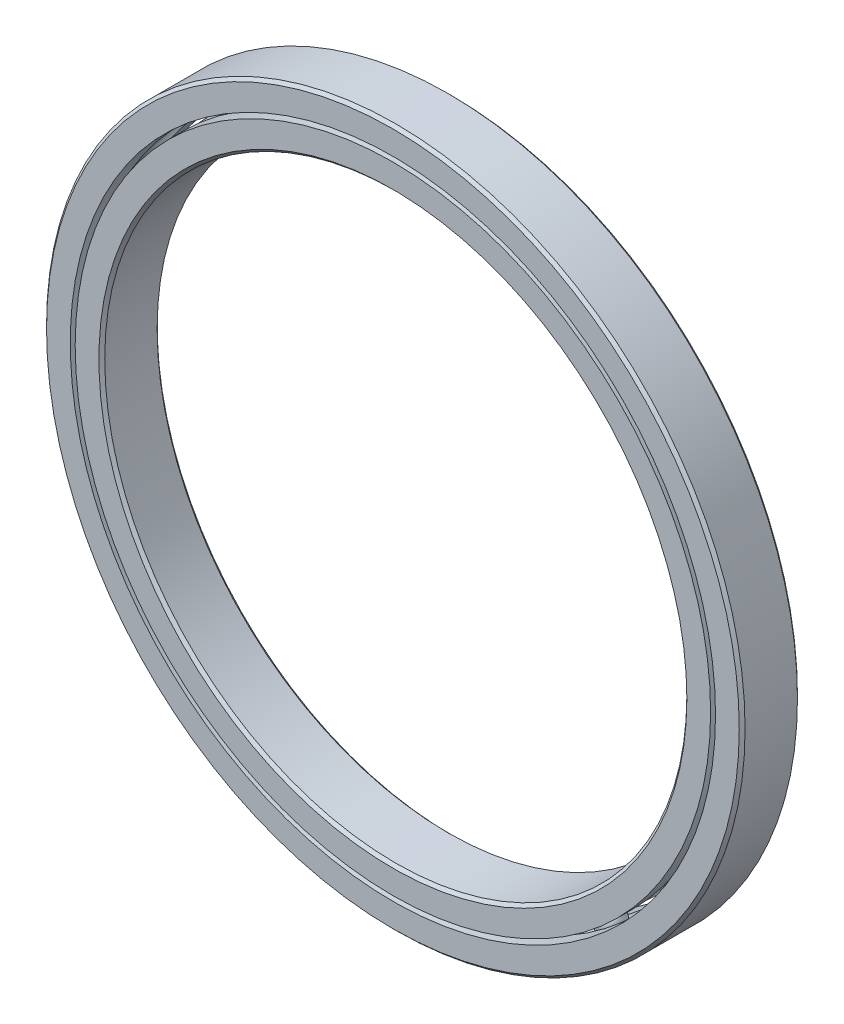
ISO-10303-21;
HEADER;
FILE_DESCRIPTION(('STEP AP214'),'2;1');
FILE_NAME('part.step','',(''),(''),'','','');
FILE_SCHEMA(('AUTOMOTIVE_DESIGN { 1 0 10303 214 1 1 1 1 }'));
ENDSEC;
DATA;
#1=APPLICATION_CONTEXT('core data for automotive mechanical design processes');
#2=APPLICATION_PROTOCOL_DEFINITION('international standard','automotive_design',2000,#1);
#3=PRODUCT_CONTEXT('',#1,'mechanical');
#4=PRODUCT('Part','Part','',(#3));
#5=PRODUCT_RELATED_PRODUCT_CATEGORY('part','',(#4));
#6=PRODUCT_DEFINITION_FORMATION('','',#4);
#7=PRODUCT_DEFINITION_CONTEXT('part definition',#1,'design');
#8=PRODUCT_DEFINITION('design','',#6,#7);
#9=PRODUCT_DEFINITION_SHAPE('','',#8);
#10=(LENGTH_UNIT() NAMED_UNIT(*) SI_UNIT(.MILLI.,.METRE.));
#11=(NAMED_UNIT(*) PLANE_ANGLE_UNIT() SI_UNIT($,.RADIAN.));
#12=(NAMED_UNIT(*) SI_UNIT($,.STERADIAN.) SOLID_ANGLE_UNIT());
#13=UNCERTAINTY_MEASURE_WITH_UNIT(LENGTH_MEASURE(1.E-05),#10,'distance_accuracy_value','');
#14=(GEOMETRIC_REPRESENTATION_CONTEXT(3) GLOBAL_UNCERTAINTY_ASSIGNED_CONTEXT((#13)) GLOBAL_UNIT_ASSIGNED_CONTEXT((#10,
#11,#12)) REPRESENTATION_CONTEXT('',''));
#15=CARTESIAN_POINT('',(0.,0.,0.));
#16=DIRECTION('',(0.,0.,1.));
#17=DIRECTION('',(1.,0.,0.));
#18=AXIS2_PLACEMENT_3D('',#15,#16,#17);
#19=CARTESIAN_POINT('',(-20.5283999363143,28.2549185285453,0.));
#20=DIRECTION('',(0.,0.,1.));
#21=DIRECTION('',(-0.587785252292462,0.809016994374955,0.));
#22=AXIS2_PLACEMENT_3D('',#19,#20,#21);
#23=SPHERICAL_SURFACE('',#22,1.4364572590072);
#24=CARTESIAN_POINT('',(-20.5283999363143,28.2549185285453,1.4364572590072));
#25=VERTEX_POINT('',#24);
#26=VERTEX_LOOP('',#25);
#27=FACE_BOUND('',#26,.T.);
#28=ADVANCED_FACE('F37',(#27),#23,.T.);
#29=CLOSED_SHELL('',(#28));
#30=MANIFOLD_SOLID_BREP('B2',#29);
#31=CARTESIAN_POINT('',(-33.2156488316081,10.7924185285454,0.));
#32=DIRECTION('',(0.,0.,1.));
#33=DIRECTION('',(-0.95105651629515,0.309016994374958,0.));
#34=AXIS2_PLACEMENT_3D('',#31,#32,#33);
#35=SPHERICAL_SURFACE('',#34,1.4364572590072);
#36=CARTESIAN_POINT('',(-33.2156488316081,10.7924185285454,1.4364572590072));
#37=VERTEX_POINT('',#36);
#38=VERTEX_LOOP('',#37);
#39=FACE_BOUND('',#38,.T.);
#40=ADVANCED_FACE('F57',(#39),#35,.T.);
#41=CLOSED_SHELL('',(#40));
#42=MANIFOLD_SOLID_BREP('B6',#41);
#43=CARTESIAN_POINT('',(-33.2156488316083,-10.7924185285447,0.));
#44=DIRECTION('',(0.,0.,1.));
#45=DIRECTION('',(-0.951056516295157,-0.309016994374938,0.));
#46=AXIS2_PLACEMENT_3D('',#43,#44,#45);
#47=SPHERICAL_SURFACE('',#46,1.4364572590072);
#48=CARTESIAN_POINT('',(-33.2156488316083,-10.7924185285447,1.4364572590072));
#49=VERTEX_POINT('',#48);
#50=VERTEX_LOOP('',#49);
#51=FACE_BOUND('',#50,.T.);
#52=ADVANCED_FACE('F77',(#51),#47,.T.);
#53=CLOSED_SHELL('',(#52));
#54=MANIFOLD_SOLID_BREP('B33',#53);
#55=CARTESIAN_POINT('',(-20.5283999363149,-28.2549185285449,0.));
#56=DIRECTION('',(0.,0.,1.));
#57=DIRECTION('',(-0.58778525229248,-0.809016994374942,0.));
#58=AXIS2_PLACEMENT_3D('',#55,#56,#57);
#59=SPHERICAL_SURFACE('',#58,1.4364572590072);
#60=CARTESIAN_POINT('',(-20.5283999363149,-28.2549185285449,1.4364572590072));
#61=VERTEX_POINT('',#60);
#62=VERTEX_LOOP('',#61);
#63=FACE_BOUND('',#62,.T.);
#64=ADVANCED_FACE('F97',(#63),#59,.T.);
#65=CLOSED_SHELL('',(#64));
#66=MANIFOLD_SOLID_BREP('B53',#65);
#67=CARTESIAN_POINT('',(-2.43879971518193E-13,-34.925,0.));
#68=DIRECTION('',(0.,0.,1.));
#69=DIRECTION('',(0.,-1.,0.));
#70=AXIS2_PLACEMENT_3D('',#67,#68,#69);
#71=SPHERICAL_SURFACE('',#70,1.4364572590072);
#72=CARTESIAN_POINT('',(-2.43879971518193E-13,-34.925,1.4364572590072));
#73=VERTEX_POINT('',#72);
#74=VERTEX_LOOP('',#73);
#75=FACE_BOUND('',#74,.T.);
#76=ADVANCED_FACE('F117',(#75),#71,.T.);
#77=CLOSED_SHELL('',(#76));
#78=MANIFOLD_SOLID_BREP('B73',#77);
#79=CARTESIAN_POINT('',(20.5283999363145,-28.2549185285452,0.));
#80=DIRECTION('',(0.,0.,1.));
#81=DIRECTION('',(0.587785252292469,-0.809016994374951,0.));
#82=AXIS2_PLACEMENT_3D('',#79,#80,#81);
#83=SPHERICAL_SURFACE('',#82,1.4364572590072);
#84=CARTESIAN_POINT('',(20.5283999363145,-28.2549185285452,1.4364572590072));
#85=VERTEX_POINT('',#84);
#86=VERTEX_LOOP('',#85);
#87=FACE_BOUND('',#86,.T.);
#88=ADVANCED_FACE('F137',(#87),#83,.T.);
#89=CLOSED_SHELL('',(#88));
#90=MANIFOLD_SOLID_BREP('B93',#89);
#91=CARTESIAN_POINT('',(33.2156488316082,-10.7924185285452,0.));
#92=DIRECTION('',(0.,0.,1.));
#93=DIRECTION('',(0.951056516295152,-0.309016994374952,0.));
#94=AXIS2_PLACEMENT_3D('',#91,#92,#93);
#95=SPHERICAL_SURFACE('',#94,1.4364572590072);
#96=CARTESIAN_POINT('',(33.2156488316082,-10.7924185285452,1.4364572590072));
#97=VERTEX_POINT('',#96);
#98=VERTEX_LOOP('',#97);
#99=FACE_BOUND('',#98,.T.);
#100=ADVANCED_FACE('F157',(#99),#95,.T.);
#101=CLOSED_SHELL('',(#100));
#102=MANIFOLD_SOLID_BREP('B113',#101);
#103=CARTESIAN_POINT('',(33.2156488316083,10.7924185285449,0.));
#104=DIRECTION('',(0.,0.,1.));
#105=DIRECTION('',(0.951056516295155,0.309016994374945,0.));
#106=AXIS2_PLACEMENT_3D('',#103,#104,#105);
#107=SPHERICAL_SURFACE('',#106,1.4364572590072);
#108=CARTESIAN_POINT('',(33.2156488316083,10.7924185285449,1.4364572590072));
#109=VERTEX_POINT('',#108);
#110=VERTEX_LOOP('',#109);
#111=FACE_BOUND('',#110,.T.);
#112=ADVANCED_FACE('F177',(#111),#107,.T.);
#113=CLOSED_SHELL('',(#112));
#114=MANIFOLD_SOLID_BREP('B133',#113);
#115=CARTESIAN_POINT('',(20.5283999363147,28.254918528545,0.));
#116=DIRECTION('',(0.,0.,1.));
#117=DIRECTION('',(0.587785252292474,0.809016994374947,0.));
#118=AXIS2_PLACEMENT_3D('',#115,#116,#117);
#119=SPHERICAL_SURFACE('',#118,1.4364572590072);
#120=CARTESIAN_POINT('',(20.5283999363147,28.254918528545,1.4364572590072));
#121=VERTEX_POINT('',#120);
#122=VERTEX_LOOP('',#121);
#123=FACE_BOUND('',#122,.T.);
#124=ADVANCED_FACE('F197',(#123),#119,.T.);
#125=CLOSED_SHELL('',(#124));
#126=MANIFOLD_SOLID_BREP('B153',#125);
#127=CARTESIAN_POINT('',(0.,34.925,0.));
#128=DIRECTION('',(0.,0.,1.));
#129=DIRECTION('',(0.,1.,0.));
#130=AXIS2_PLACEMENT_3D('',#127,#128,#129);
#131=SPHERICAL_SURFACE('',#130,1.4364572590072);
#132=CARTESIAN_POINT('',(0.,34.925,1.4364572590072));
#133=VERTEX_POINT('',#132);
#134=VERTEX_LOOP('',#133);
#135=FACE_BOUND('',#134,.T.);
#136=ADVANCED_FACE('F219',(#135),#131,.T.);
#137=CLOSED_SHELL('',(#136));
#138=MANIFOLD_SOLID_BREP('B173',#137);
#139=CARTESIAN_POINT('',(0.,34.6563461538462,3.17500000000001));
#140=DIRECTION('',(0.,0.,-1.));
#141=DIRECTION('',(-1.,0.,0.));
#142=AXIS2_PLACEMENT_3D('',#139,#140,#141);
#143=PLANE('',#142);
#144=CARTESIAN_POINT('',(0.,0.,3.17500000000001));
#145=DIRECTION('',(0.,0.,1.));
#146=DIRECTION('',(1.,0.,0.));
#147=AXIS2_PLACEMENT_3D('',#144,#145,#146);
#148=CIRCLE('',#147,32.0675);
#149=CARTESIAN_POINT('',(32.0675,0.,3.17500000000001));
#150=VERTEX_POINT('',#149);
#151=EDGE_CURVE('E266',#150,#150,#148,.T.);
#152=ORIENTED_EDGE('',*,*,#151,.F.);
#153=EDGE_LOOP('',(#152));
#154=FACE_BOUND('',#153,.T.);
#155=CARTESIAN_POINT('',(0.,0.,3.17500000000001));
#156=DIRECTION('',(0.,0.,1.));
#157=DIRECTION('',(1.,0.,0.));
#158=AXIS2_PLACEMENT_3D('',#155,#156,#157);
#159=CIRCLE('',#158,34.6563461538462);
#160=CARTESIAN_POINT('',(34.6563461538462,0.,3.17500000000001));
#161=VERTEX_POINT('',#160);
#162=EDGE_CURVE('E218',#161,#161,#159,.T.);
#163=ORIENTED_EDGE('',*,*,#162,.T.);
#164=EDGE_LOOP('',(#163));
#165=FACE_BOUND('',#164,.T.);
#166=ADVANCED_FACE('F238',(#154,#165),#143,.F.);
#167=CARTESIAN_POINT('',(0.,0.,3.175));
#168=DIRECTION('',(0.,0.,1.));
#169=DIRECTION('',(1.,0.,0.));
#170=AXIS2_PLACEMENT_3D('',#167,#168,#169);
#171=CYLINDRICAL_SURFACE('',#170,34.6563461538462);
#172=ORIENTED_EDGE('',*,*,#162,.F.);
#173=EDGE_LOOP('',(#172));
#174=FACE_BOUND('',#173,.T.);
#175=CARTESIAN_POINT('',(0.,0.,1.41111111111111));
#176=DIRECTION('',(0.,0.,1.));
#177=DIRECTION('',(1.,0.,0.));
#178=AXIS2_PLACEMENT_3D('',#175,#176,#177);
#179=CIRCLE('',#178,34.6563461538462);
#180=CARTESIAN_POINT('',(34.6563461538462,0.,1.41111111111111));
#181=VERTEX_POINT('',#180);
#182=EDGE_CURVE('E244',#181,#181,#179,.T.);
#183=ORIENTED_EDGE('',*,*,#182,.T.);
#184=EDGE_LOOP('',(#183));
#185=FACE_BOUND('',#184,.T.);
#186=ADVANCED_FACE('F273',(#174,#185),#171,.T.);
#187=CARTESIAN_POINT('',(0.,0.,0.));
#188=DIRECTION('',(0.,0.,1.));
#189=DIRECTION('',(1.,0.,0.));
#190=AXIS2_PLACEMENT_3D('',#187,#188,#189);
#191=TOROIDAL_SURFACE('',#190,34.925,1.43645725900719);
#192=ORIENTED_EDGE('',*,*,#182,.F.);
#193=EDGE_LOOP('',(#192));
#194=FACE_BOUND('',#193,.T.);
#195=CARTESIAN_POINT('',(0.,0.,-1.41111111111112));
#196=DIRECTION('',(0.,0.,1.));
#197=DIRECTION('',(1.,0.,0.));
#198=AXIS2_PLACEMENT_3D('',#195,#196,#197);
#199=CIRCLE('',#198,34.6563461538462);
#200=CARTESIAN_POINT('',(34.6563461538462,0.,-1.41111111111112));
#201=VERTEX_POINT('',#200);
#202=EDGE_CURVE('E248',#201,#201,#199,.T.);
#203=ORIENTED_EDGE('',*,*,#202,.T.);
#204=EDGE_LOOP('',(#203));
#205=FACE_BOUND('',#204,.T.);
#206=ADVANCED_FACE('F277',(#194,#205),#191,.F.);
#207=CARTESIAN_POINT('',(0.,0.,3.175));
#208=DIRECTION('',(0.,0.,1.));
#209=DIRECTION('',(1.,0.,0.));
#210=AXIS2_PLACEMENT_3D('',#207,#208,#209);
#211=CYLINDRICAL_SURFACE('',#210,34.6563461538462);
#212=ORIENTED_EDGE('',*,*,#202,.F.);
#213=EDGE_LOOP('',(#212));
#214=FACE_BOUND('',#213,.T.);
#215=CARTESIAN_POINT('',(0.,0.,-3.17500000000001));
#216=DIRECTION('',(0.,0.,1.));
#217=DIRECTION('',(1.,0.,0.));
#218=AXIS2_PLACEMENT_3D('',#215,#216,#217);
#219=CIRCLE('',#218,34.6563461538462);
#220=CARTESIAN_POINT('',(34.6563461538462,0.,-3.17500000000001));
#221=VERTEX_POINT('',#220);
#222=EDGE_CURVE('E252',#221,#221,#219,.T.);
#223=ORIENTED_EDGE('',*,*,#222,.T.);
#224=EDGE_LOOP('',(#223));
#225=FACE_BOUND('',#224,.T.);
#226=ADVANCED_FACE('F282',(#214,#225),#211,.T.);
#227=CARTESIAN_POINT('',(0.,32.0675,-3.17500000000001));
#228=DIRECTION('',(0.,0.,1.));
#229=DIRECTION('',(1.,0.,0.));
#230=AXIS2_PLACEMENT_3D('',#227,#228,#229);
#231=PLANE('',#230);
#232=ORIENTED_EDGE('',*,*,#222,.F.);
#233=EDGE_LOOP('',(#232));
#234=FACE_BOUND('',#233,.T.);
#235=CARTESIAN_POINT('',(0.,0.,-3.17500000000001));
#236=DIRECTION('',(0.,0.,1.));
#237=DIRECTION('',(1.,0.,0.));
#238=AXIS2_PLACEMENT_3D('',#235,#236,#237);
#239=CIRCLE('',#238,32.0675);
#240=CARTESIAN_POINT('',(32.0675,0.,-3.17500000000001));
#241=VERTEX_POINT('',#240);
#242=EDGE_CURVE('E257',#241,#241,#239,.T.);
#243=ORIENTED_EDGE('',*,*,#242,.T.);
#244=EDGE_LOOP('',(#243));
#245=FACE_BOUND('',#244,.T.);
#246=ADVANCED_FACE('F288',(#234,#245),#231,.F.);
#247=CARTESIAN_POINT('',(0.,0.,-2.8575));
#248=DIRECTION('',(0.,0.,-1.));
#249=DIRECTION('',(-1.,0.,0.));
#250=AXIS2_PLACEMENT_3D('',#247,#248,#249);
#251=CONICAL_SURFACE('',#250,31.75,0.785398163397444);
#252=ORIENTED_EDGE('',*,*,#242,.F.);
#253=EDGE_LOOP('',(#252));
#254=FACE_BOUND('',#253,.T.);
#255=CARTESIAN_POINT('',(0.,0.,-2.8575));
#256=DIRECTION('',(0.,0.,1.));
#257=DIRECTION('',(1.,0.,0.));
#258=AXIS2_PLACEMENT_3D('',#255,#256,#257);
#259=CIRCLE('',#258,31.75);
#260=CARTESIAN_POINT('',(31.75,0.,-2.8575));
#261=VERTEX_POINT('',#260);
#262=EDGE_CURVE('E260',#261,#261,#259,.T.);
#263=ORIENTED_EDGE('',*,*,#262,.T.);
#264=EDGE_LOOP('',(#263));
#265=FACE_BOUND('',#264,.T.);
#266=ADVANCED_FACE('F292',(#254,#265),#251,.F.);
#267=CARTESIAN_POINT('',(0.,0.,3.175));
#268=DIRECTION('',(0.,0.,1.));
#269=DIRECTION('',(1.,0.,0.));
#270=AXIS2_PLACEMENT_3D('',#267,#268,#269);
#271=CYLINDRICAL_SURFACE('',#270,31.75);
#272=ORIENTED_EDGE('',*,*,#262,.F.);
#273=EDGE_LOOP('',(#272));
#274=FACE_BOUND('',#273,.T.);
#275=CARTESIAN_POINT('',(0.,0.,2.85750000000001));
#276=DIRECTION('',(0.,0.,1.));
#277=DIRECTION('',(1.,0.,0.));
#278=AXIS2_PLACEMENT_3D('',#275,#276,#277);
#279=CIRCLE('',#278,31.75);
#280=CARTESIAN_POINT('',(31.75,0.,2.85750000000001));
#281=VERTEX_POINT('',#280);
#282=EDGE_CURVE('E263',#281,#281,#279,.T.);
#283=ORIENTED_EDGE('',*,*,#282,.T.);
#284=EDGE_LOOP('',(#283));
#285=FACE_BOUND('',#284,.T.);
#286=ADVANCED_FACE('F296',(#274,#285),#271,.F.);
#287=CARTESIAN_POINT('',(0.,0.,3.17500000000001));
#288=DIRECTION('',(0.,0.,1.));
#289=DIRECTION('',(1.,0.,0.));
#290=AXIS2_PLACEMENT_3D('',#287,#288,#289);
#291=CONICAL_SURFACE('',#290,32.0675,0.785398163397446);
#292=ORIENTED_EDGE('',*,*,#282,.F.);
#293=EDGE_LOOP('',(#292));
#294=FACE_BOUND('',#293,.T.);
#295=ORIENTED_EDGE('',*,*,#151,.T.);
#296=EDGE_LOOP('',(#295));
#297=FACE_BOUND('',#296,.T.);
#298=ADVANCED_FACE('F270',(#294,#297),#291,.F.);
#299=CLOSED_SHELL('',(#166,#186,#206,#226,#246,#266,#286,#298));
#300=MANIFOLD_SOLID_BREP('B193',#299);
#301=CARTESIAN_POINT('',(0.,0.,2.8575));
#302=DIRECTION('',(0.,0.,-1.));
#303=DIRECTION('',(-1.,0.,0.));
#304=AXIS2_PLACEMENT_3D('',#301,#302,#303);
#305=CONICAL_SURFACE('',#304,38.1,0.785398163397446);
#306=CARTESIAN_POINT('',(0.,0.,3.17500000000001));
#307=DIRECTION('',(0.,0.,1.));
#308=DIRECTION('',(1.,0.,0.));
#309=AXIS2_PLACEMENT_3D('',#306,#307,#308);
#310=CIRCLE('',#309,37.7825);
#311=CARTESIAN_POINT('',(37.7825,0.,3.17500000000001));
#312=VERTEX_POINT('',#311);
#313=EDGE_CURVE('E387',#312,#312,#310,.T.);
#314=ORIENTED_EDGE('',*,*,#313,.F.);
#315=EDGE_LOOP('',(#314));
#316=FACE_BOUND('',#315,.T.);
#317=CARTESIAN_POINT('',(0.,0.,2.8575));
#318=DIRECTION('',(0.,0.,1.));
#319=DIRECTION('',(1.,0.,0.));
#320=AXIS2_PLACEMENT_3D('',#317,#318,#319);
#321=CIRCLE('',#320,38.1);
#322=CARTESIAN_POINT('',(38.1,0.,2.8575));
#323=VERTEX_POINT('',#322);
#324=EDGE_CURVE('E237',#323,#323,#321,.T.);
#325=ORIENTED_EDGE('',*,*,#324,.T.);
#326=EDGE_LOOP('',(#325));
#327=FACE_BOUND('',#326,.T.);
#328=ADVANCED_FACE('F359',(#316,#327),#305,.T.);
#329=CARTESIAN_POINT('',(0.,0.,3.175));
#330=DIRECTION('',(0.,0.,1.));
#331=DIRECTION('',(1.,0.,0.));
#332=AXIS2_PLACEMENT_3D('',#329,#330,#331);
#333=CYLINDRICAL_SURFACE('',#332,38.1);
#334=ORIENTED_EDGE('',*,*,#324,.F.);
#335=EDGE_LOOP('',(#334));
#336=FACE_BOUND('',#335,.T.);
#337=CARTESIAN_POINT('',(0.,0.,-2.8575));
#338=DIRECTION('',(0.,0.,1.));
#339=DIRECTION('',(1.,0.,0.));
#340=AXIS2_PLACEMENT_3D('',#337,#338,#339);
#341=CIRCLE('',#340,38.1);
#342=CARTESIAN_POINT('',(38.1,0.,-2.8575));
#343=VERTEX_POINT('',#342);
#344=EDGE_CURVE('E365',#343,#343,#341,.T.);
#345=ORIENTED_EDGE('',*,*,#344,.T.);
#346=EDGE_LOOP('',(#345));
#347=FACE_BOUND('',#346,.T.);
#348=ADVANCED_FACE('F394',(#336,#347),#333,.T.);
#349=CARTESIAN_POINT('',(0.,0.,-3.17500000000001));
#350=DIRECTION('',(0.,0.,1.));
#351=DIRECTION('',(1.,0.,0.));
#352=AXIS2_PLACEMENT_3D('',#349,#350,#351);
#353=CONICAL_SURFACE('',#352,37.7825,0.785398163397444);
#354=ORIENTED_EDGE('',*,*,#344,.F.);
#355=EDGE_LOOP('',(#354));
#356=FACE_BOUND('',#355,.T.);
#357=CARTESIAN_POINT('',(0.,0.,-3.17500000000001));
#358=DIRECTION('',(0.,0.,1.));
#359=DIRECTION('',(1.,0.,0.));
#360=AXIS2_PLACEMENT_3D('',#357,#358,#359);
#361=CIRCLE('',#360,37.7825);
#362=CARTESIAN_POINT('',(37.7825,0.,-3.17500000000001));
#363=VERTEX_POINT('',#362);
#364=EDGE_CURVE('E369',#363,#363,#361,.T.);
#365=ORIENTED_EDGE('',*,*,#364,.T.);
#366=EDGE_LOOP('',(#365));
#367=FACE_BOUND('',#366,.T.);
#368=ADVANCED_FACE('F398',(#356,#367),#353,.T.);
#369=CARTESIAN_POINT('',(0.,37.7825,-3.17500000000001));
#370=DIRECTION('',(0.,0.,1.));
#371=DIRECTION('',(1.,0.,0.));
#372=AXIS2_PLACEMENT_3D('',#369,#370,#371);
#373=PLANE('',#372);
#374=ORIENTED_EDGE('',*,*,#364,.F.);
#375=EDGE_LOOP('',(#374));
#376=FACE_BOUND('',#375,.T.);
#377=CARTESIAN_POINT('',(0.,0.,-3.17500000000001));
#378=DIRECTION('',(0.,0.,1.));
#379=DIRECTION('',(1.,0.,0.));
#380=AXIS2_PLACEMENT_3D('',#377,#378,#379);
#381=CIRCLE('',#380,35.1936538461538);
#382=CARTESIAN_POINT('',(35.1936538461538,0.,-3.17500000000001));
#383=VERTEX_POINT('',#382);
#384=EDGE_CURVE('E373',#383,#383,#381,.T.);
#385=ORIENTED_EDGE('',*,*,#384,.T.);
#386=EDGE_LOOP('',(#385));
#387=FACE_BOUND('',#386,.T.);
#388=ADVANCED_FACE('F403',(#376,#387),#373,.F.);
#389=CARTESIAN_POINT('',(0.,0.,3.175));
#390=DIRECTION('',(0.,0.,1.));
#391=DIRECTION('',(1.,0.,0.));
#392=AXIS2_PLACEMENT_3D('',#389,#390,#391);
#393=CYLINDRICAL_SURFACE('',#392,35.1936538461538);
#394=ORIENTED_EDGE('',*,*,#384,.F.);
#395=EDGE_LOOP('',(#394));
#396=FACE_BOUND('',#395,.T.);
#397=CARTESIAN_POINT('',(0.,0.,-1.41111111111111));
#398=DIRECTION('',(0.,0.,1.));
#399=DIRECTION('',(1.,0.,0.));
#400=AXIS2_PLACEMENT_3D('',#397,#398,#399);
#401=CIRCLE('',#400,35.1936538461538);
#402=CARTESIAN_POINT('',(35.1936538461538,0.,-1.41111111111111));
#403=VERTEX_POINT('',#402);
#404=EDGE_CURVE('E378',#403,#403,#401,.T.);
#405=ORIENTED_EDGE('',*,*,#404,.T.);
#406=EDGE_LOOP('',(#405));
#407=FACE_BOUND('',#406,.T.);
#408=ADVANCED_FACE('F409',(#396,#407),#393,.F.);
#409=CARTESIAN_POINT('',(0.,0.,0.));
#410=DIRECTION('',(0.,0.,1.));
#411=DIRECTION('',(1.,0.,0.));
#412=AXIS2_PLACEMENT_3D('',#409,#410,#411);
#413=TOROIDAL_SURFACE('',#412,34.925,1.4364572590072);
#414=ORIENTED_EDGE('',*,*,#404,.F.);
#415=EDGE_LOOP('',(#414));
#416=FACE_BOUND('',#415,.T.);
#417=CARTESIAN_POINT('',(0.,0.,1.41111111111111));
#418=DIRECTION('',(0.,0.,1.));
#419=DIRECTION('',(1.,0.,0.));
#420=AXIS2_PLACEMENT_3D('',#417,#418,#419);
#421=CIRCLE('',#420,35.1936538461538);
#422=CARTESIAN_POINT('',(35.1936538461538,0.,1.41111111111111));
#423=VERTEX_POINT('',#422);
#424=EDGE_CURVE('E381',#423,#423,#421,.T.);
#425=ORIENTED_EDGE('',*,*,#424,.T.);
#426=EDGE_LOOP('',(#425));
#427=FACE_BOUND('',#426,.T.);
#428=ADVANCED_FACE('F413',(#416,#427),#413,.F.);
#429=CARTESIAN_POINT('',(0.,0.,3.175));
#430=DIRECTION('',(0.,0.,1.));
#431=DIRECTION('',(1.,0.,0.));
#432=AXIS2_PLACEMENT_3D('',#429,#430,#431);
#433=CYLINDRICAL_SURFACE('',#432,35.1936538461538);
#434=ORIENTED_EDGE('',*,*,#424,.F.);
#435=EDGE_LOOP('',(#434));
#436=FACE_BOUND('',#435,.T.);
#437=CARTESIAN_POINT('',(0.,0.,3.175));
#438=DIRECTION('',(0.,0.,1.));
#439=DIRECTION('',(1.,0.,0.));
#440=AXIS2_PLACEMENT_3D('',#437,#438,#439);
#441=CIRCLE('',#440,35.1936538461538);
#442=CARTESIAN_POINT('',(35.1936538461538,0.,3.175));
#443=VERTEX_POINT('',#442);
#444=EDGE_CURVE('E384',#443,#443,#441,.T.);
#445=ORIENTED_EDGE('',*,*,#444,.T.);
#446=EDGE_LOOP('',(#445));
#447=FACE_BOUND('',#446,.T.);
#448=ADVANCED_FACE('F417',(#436,#447),#433,.F.);
#449=CARTESIAN_POINT('',(0.,37.7825,3.17500000000001));
#450=DIRECTION('',(0.,0.,-1.));
#451=DIRECTION('',(-1.,0.,0.));
#452=AXIS2_PLACEMENT_3D('',#449,#450,#451);
#453=PLANE('',#452);
#454=ORIENTED_EDGE('',*,*,#444,.F.);
#455=EDGE_LOOP('',(#454));
#456=FACE_BOUND('',#455,.T.);
#457=ORIENTED_EDGE('',*,*,#313,.T.);
#458=EDGE_LOOP('',(#457));
#459=FACE_BOUND('',#458,.T.);
#460=ADVANCED_FACE('F391',(#456,#459),#453,.F.);
#461=CLOSED_SHELL('',(#328,#348,#368,#388,#408,#428,#448,#460));
#462=MANIFOLD_SOLID_BREP('B213',#461);
#463=ADVANCED_BREP_SHAPE_REPRESENTATION('',(#18,#30,#42,#54,#66,#78,#90,#102,#114,#126,#138,
#300,#462),#14);
#464=SHAPE_DEFINITION_REPRESENTATION(#9,#463);
ENDSEC;
END-ISO-10303-21;
